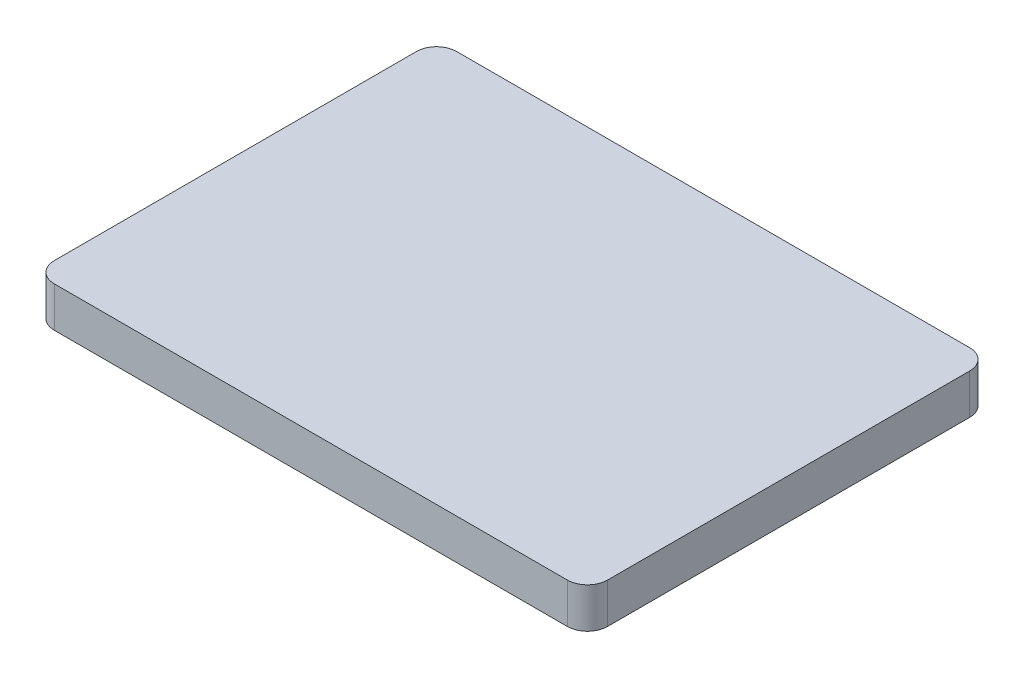
ISO-10303-21;
HEADER;
FILE_DESCRIPTION(('STEP AP214'),'2;1');
FILE_NAME('part.step','',(''),(''),'','','');
FILE_SCHEMA(('AUTOMOTIVE_DESIGN { 1 0 10303 214 1 1 1 1 }'));
ENDSEC;
DATA;
#1=APPLICATION_CONTEXT('core data for automotive mechanical design processes');
#2=APPLICATION_PROTOCOL_DEFINITION('international standard','automotive_design',2000,#1);
#3=PRODUCT_CONTEXT('',#1,'mechanical');
#4=PRODUCT('Part','Part','',(#3));
#5=PRODUCT_RELATED_PRODUCT_CATEGORY('part','',(#4));
#6=PRODUCT_DEFINITION_FORMATION('','',#4);
#7=PRODUCT_DEFINITION_CONTEXT('part definition',#1,'design');
#8=PRODUCT_DEFINITION('design','',#6,#7);
#9=PRODUCT_DEFINITION_SHAPE('','',#8);
#10=(LENGTH_UNIT() NAMED_UNIT(*) SI_UNIT(.MILLI.,.METRE.));
#11=(NAMED_UNIT(*) PLANE_ANGLE_UNIT() SI_UNIT($,.RADIAN.));
#12=(NAMED_UNIT(*) SI_UNIT($,.STERADIAN.) SOLID_ANGLE_UNIT());
#13=UNCERTAINTY_MEASURE_WITH_UNIT(LENGTH_MEASURE(1.E-05),#10,'distance_accuracy_value','');
#14=(GEOMETRIC_REPRESENTATION_CONTEXT(3) GLOBAL_UNCERTAINTY_ASSIGNED_CONTEXT((#13)) GLOBAL_UNIT_ASSIGNED_CONTEXT((#10,
#11,#12)) REPRESENTATION_CONTEXT('',''));
#15=CARTESIAN_POINT('',(0.,0.,0.));
#16=DIRECTION('',(0.,0.,1.));
#17=DIRECTION('',(1.,0.,0.));
#18=AXIS2_PLACEMENT_3D('',#15,#16,#17);
#19=CARTESIAN_POINT('',(2.75,0.4,2.));
#20=DIRECTION('',(-1.,0.,0.));
#21=DIRECTION('',(0.,0.,1.));
#22=AXIS2_PLACEMENT_3D('',#19,#20,#21);
#23=PLANE('',#22);
#24=DIRECTION('',(0.,0.,-1.));
#25=VECTOR('',#24,1.);
#26=CARTESIAN_POINT('',(2.75,0.,2.));
#27=LINE('',#26,#25);
#28=CARTESIAN_POINT('',(2.75,0.,1.8));
#29=VERTEX_POINT('',#28);
#30=CARTESIAN_POINT('',(2.75,0.,-1.8));
#31=VERTEX_POINT('',#30);
#32=EDGE_CURVE('E136',#29,#31,#27,.T.);
#33=ORIENTED_EDGE('',*,*,#32,.T.);
#34=DIRECTION('',(0.,-1.,0.));
#35=VECTOR('',#34,1.);
#36=CARTESIAN_POINT('',(2.75,0.4,-1.8));
#37=LINE('',#36,#35);
#38=CARTESIAN_POINT('',(2.75,0.4,-1.8));
#39=VERTEX_POINT('',#38);
#40=EDGE_CURVE('E111',#31,#39,#37,.F.);
#41=ORIENTED_EDGE('',*,*,#40,.T.);
#42=DIRECTION('',(0.,0.,-1.));
#43=VECTOR('',#42,1.);
#44=CARTESIAN_POINT('',(2.75,0.4,2.));
#45=LINE('',#44,#43);
#46=CARTESIAN_POINT('',(2.75,0.4,1.8));
#47=VERTEX_POINT('',#46);
#48=EDGE_CURVE('E148',#47,#39,#45,.T.);
#49=ORIENTED_EDGE('',*,*,#48,.F.);
#50=DIRECTION('',(0.,-1.,0.));
#51=VECTOR('',#50,1.);
#52=CARTESIAN_POINT('',(2.75,0.4,1.8));
#53=LINE('',#52,#51);
#54=EDGE_CURVE('E117',#47,#29,#53,.T.);
#55=ORIENTED_EDGE('',*,*,#54,.T.);
#56=EDGE_LOOP('',(#33,#41,#49,#55));
#57=FACE_BOUND('',#56,.T.);
#58=ADVANCED_FACE('F39',(#57),#23,.F.);
#59=CARTESIAN_POINT('',(-2.75,0.4,-2.));
#60=DIRECTION('',(0.,0.,1.));
#61=DIRECTION('',(1.,0.,0.));
#62=AXIS2_PLACEMENT_3D('',#59,#60,#61);
#63=PLANE('',#62);
#64=DIRECTION('',(-1.,0.,0.));
#65=VECTOR('',#64,1.);
#66=CARTESIAN_POINT('',(-2.75,0.4,-2.));
#67=LINE('',#66,#65);
#68=CARTESIAN_POINT('',(2.55,0.4,-2.));
#69=VERTEX_POINT('',#68);
#70=CARTESIAN_POINT('',(-2.55,0.4,-2.));
#71=VERTEX_POINT('',#70);
#72=EDGE_CURVE('E127',#69,#71,#67,.T.);
#73=ORIENTED_EDGE('',*,*,#72,.F.);
#74=DIRECTION('',(0.,-1.,0.));
#75=VECTOR('',#74,1.);
#76=CARTESIAN_POINT('',(2.55,0.4,-2.));
#77=LINE('',#76,#75);
#78=CARTESIAN_POINT('',(2.55,0.,-2.));
#79=VERTEX_POINT('',#78);
#80=EDGE_CURVE('E110',#69,#79,#77,.T.);
#81=ORIENTED_EDGE('',*,*,#80,.T.);
#82=DIRECTION('',(-1.,0.,0.));
#83=VECTOR('',#82,1.);
#84=CARTESIAN_POINT('',(-2.75,0.,-2.));
#85=LINE('',#84,#83);
#86=CARTESIAN_POINT('',(-2.55,0.,-2.));
#87=VERTEX_POINT('',#86);
#88=EDGE_CURVE('E124',#79,#87,#85,.T.);
#89=ORIENTED_EDGE('',*,*,#88,.T.);
#90=DIRECTION('',(0.,-1.,0.));
#91=VECTOR('',#90,1.);
#92=CARTESIAN_POINT('',(-2.55,0.4,-2.));
#93=LINE('',#92,#91);
#94=EDGE_CURVE('E130',#87,#71,#93,.F.);
#95=ORIENTED_EDGE('',*,*,#94,.T.);
#96=EDGE_LOOP('',(#73,#81,#89,#95));
#97=FACE_BOUND('',#96,.T.);
#98=ADVANCED_FACE('F123',(#97),#63,.F.);
#99=CARTESIAN_POINT('',(-2.75,0.4,2.));
#100=DIRECTION('',(1.,0.,0.));
#101=DIRECTION('',(0.,0.,-1.));
#102=AXIS2_PLACEMENT_3D('',#99,#100,#101);
#103=PLANE('',#102);
#104=DIRECTION('',(0.,0.,1.));
#105=VECTOR('',#104,1.);
#106=CARTESIAN_POINT('',(-2.75,0.,2.));
#107=LINE('',#106,#105);
#108=CARTESIAN_POINT('',(-2.75,0.,-1.8));
#109=VERTEX_POINT('',#108);
#110=CARTESIAN_POINT('',(-2.75,0.,1.8));
#111=VERTEX_POINT('',#110);
#112=EDGE_CURVE('E135',#109,#111,#107,.T.);
#113=ORIENTED_EDGE('',*,*,#112,.T.);
#114=DIRECTION('',(0.,-1.,0.));
#115=VECTOR('',#114,1.);
#116=CARTESIAN_POINT('',(-2.75,0.4,1.8));
#117=LINE('',#116,#115);
#118=CARTESIAN_POINT('',(-2.75,0.4,1.8));
#119=VERTEX_POINT('',#118);
#120=EDGE_CURVE('E11',#111,#119,#117,.F.);
#121=ORIENTED_EDGE('',*,*,#120,.T.);
#122=DIRECTION('',(0.,0.,1.));
#123=VECTOR('',#122,1.);
#124=CARTESIAN_POINT('',(-2.75,0.4,2.));
#125=LINE('',#124,#123);
#126=CARTESIAN_POINT('',(-2.75,0.4,-1.8));
#127=VERTEX_POINT('',#126);
#128=EDGE_CURVE('E187',#127,#119,#125,.T.);
#129=ORIENTED_EDGE('',*,*,#128,.F.);
#130=DIRECTION('',(0.,-1.,0.));
#131=VECTOR('',#130,1.);
#132=CARTESIAN_POINT('',(-2.75,0.4,-1.8));
#133=LINE('',#132,#131);
#134=EDGE_CURVE('E48',#127,#109,#133,.T.);
#135=ORIENTED_EDGE('',*,*,#134,.T.);
#136=EDGE_LOOP('',(#113,#121,#129,#135));
#137=FACE_BOUND('',#136,.T.);
#138=ADVANCED_FACE('F185',(#137),#103,.F.);
#139=CARTESIAN_POINT('',(-2.75,0.4,2.));
#140=DIRECTION('',(0.,0.,-1.));
#141=DIRECTION('',(-1.,0.,0.));
#142=AXIS2_PLACEMENT_3D('',#139,#140,#141);
#143=PLANE('',#142);
#144=DIRECTION('',(1.,0.,0.));
#145=VECTOR('',#144,1.);
#146=CARTESIAN_POINT('',(-2.75,0.,2.));
#147=LINE('',#146,#145);
#148=CARTESIAN_POINT('',(-2.55,0.,2.));
#149=VERTEX_POINT('',#148);
#150=CARTESIAN_POINT('',(2.55,0.,2.));
#151=VERTEX_POINT('',#150);
#152=EDGE_CURVE('E141',#149,#151,#147,.T.);
#153=ORIENTED_EDGE('',*,*,#152,.T.);
#154=DIRECTION('',(0.,-1.,0.));
#155=VECTOR('',#154,1.);
#156=CARTESIAN_POINT('',(2.55,0.4,2.));
#157=LINE('',#156,#155);
#158=CARTESIAN_POINT('',(2.55,0.4,2.));
#159=VERTEX_POINT('',#158);
#160=EDGE_CURVE('E55',#151,#159,#157,.F.);
#161=ORIENTED_EDGE('',*,*,#160,.T.);
#162=DIRECTION('',(1.,0.,0.));
#163=VECTOR('',#162,1.);
#164=CARTESIAN_POINT('',(-2.75,0.4,2.));
#165=LINE('',#164,#163);
#166=CARTESIAN_POINT('',(-2.55,0.4,2.));
#167=VERTEX_POINT('',#166);
#168=EDGE_CURVE('E150',#167,#159,#165,.T.);
#169=ORIENTED_EDGE('',*,*,#168,.F.);
#170=DIRECTION('',(0.,-1.,0.));
#171=VECTOR('',#170,1.);
#172=CARTESIAN_POINT('',(-2.55,0.4,2.));
#173=LINE('',#172,#171);
#174=EDGE_CURVE('E175',#167,#149,#173,.T.);
#175=ORIENTED_EDGE('',*,*,#174,.T.);
#176=EDGE_LOOP('',(#153,#161,#169,#175));
#177=FACE_BOUND('',#176,.T.);
#178=ADVANCED_FACE('F194',(#177),#143,.F.);
#179=CARTESIAN_POINT('',(0.,0.4,0.));
#180=DIRECTION('',(0.,-1.,0.));
#181=DIRECTION('',(0.,0.,-1.));
#182=AXIS2_PLACEMENT_3D('',#179,#180,#181);
#183=PLANE('',#182);
#184=ORIENTED_EDGE('',*,*,#48,.T.);
#185=CARTESIAN_POINT('',(2.55,0.4,-1.8));
#186=DIRECTION('',(0.,-1.,0.));
#187=DIRECTION('',(0.,0.,-1.));
#188=AXIS2_PLACEMENT_3D('',#185,#186,#187);
#189=CIRCLE('',#188,0.2);
#190=EDGE_CURVE('E172',#39,#69,#189,.F.);
#191=ORIENTED_EDGE('',*,*,#190,.T.);
#192=ORIENTED_EDGE('',*,*,#72,.T.);
#193=CARTESIAN_POINT('',(-2.55,0.4,-1.8));
#194=DIRECTION('',(0.,-1.,0.));
#195=DIRECTION('',(0.,0.,-1.));
#196=AXIS2_PLACEMENT_3D('',#193,#194,#195);
#197=CIRCLE('',#196,0.2);
#198=EDGE_CURVE('E164',#71,#127,#197,.F.);
#199=ORIENTED_EDGE('',*,*,#198,.T.);
#200=ORIENTED_EDGE('',*,*,#128,.T.);
#201=CARTESIAN_POINT('',(-2.55,0.4,1.8));
#202=DIRECTION('',(0.,-1.,0.));
#203=DIRECTION('',(0.,0.,-1.));
#204=AXIS2_PLACEMENT_3D('',#201,#202,#203);
#205=CIRCLE('',#204,0.2);
#206=EDGE_CURVE('E62',#119,#167,#205,.F.);
#207=ORIENTED_EDGE('',*,*,#206,.T.);
#208=ORIENTED_EDGE('',*,*,#168,.T.);
#209=CARTESIAN_POINT('',(2.55,0.4,1.8));
#210=DIRECTION('',(0.,-1.,0.));
#211=DIRECTION('',(0.,0.,-1.));
#212=AXIS2_PLACEMENT_3D('',#209,#210,#211);
#213=CIRCLE('',#212,0.2);
#214=EDGE_CURVE('E169',#159,#47,#213,.F.);
#215=ORIENTED_EDGE('',*,*,#214,.T.);
#216=EDGE_LOOP('',(#184,#191,#192,#199,#200,#207,#208,#215));
#217=FACE_BOUND('',#216,.T.);
#218=ADVANCED_FACE('F205',(#217),#183,.F.);
#219=CARTESIAN_POINT('',(0.,0.,0.));
#220=DIRECTION('',(0.,-1.,0.));
#221=DIRECTION('',(0.,0.,-1.));
#222=AXIS2_PLACEMENT_3D('',#219,#220,#221);
#223=PLANE('',#222);
#224=ORIENTED_EDGE('',*,*,#88,.F.);
#225=CARTESIAN_POINT('',(2.55,0.,-1.8));
#226=DIRECTION('',(0.,-1.,0.));
#227=DIRECTION('',(0.,0.,-1.));
#228=AXIS2_PLACEMENT_3D('',#225,#226,#227);
#229=CIRCLE('',#228,0.2);
#230=EDGE_CURVE('E106',#79,#31,#229,.T.);
#231=ORIENTED_EDGE('',*,*,#230,.T.);
#232=ORIENTED_EDGE('',*,*,#32,.F.);
#233=CARTESIAN_POINT('',(2.55,0.,1.8));
#234=DIRECTION('',(0.,-1.,0.));
#235=DIRECTION('',(0.,0.,-1.));
#236=AXIS2_PLACEMENT_3D('',#233,#234,#235);
#237=CIRCLE('',#236,0.2);
#238=EDGE_CURVE('E118',#29,#151,#237,.T.);
#239=ORIENTED_EDGE('',*,*,#238,.T.);
#240=ORIENTED_EDGE('',*,*,#152,.F.);
#241=CARTESIAN_POINT('',(-2.55,0.,1.8));
#242=DIRECTION('',(0.,-1.,0.));
#243=DIRECTION('',(0.,0.,-1.));
#244=AXIS2_PLACEMENT_3D('',#241,#242,#243);
#245=CIRCLE('',#244,0.2);
#246=EDGE_CURVE('E154',#149,#111,#245,.T.);
#247=ORIENTED_EDGE('',*,*,#246,.T.);
#248=ORIENTED_EDGE('',*,*,#112,.F.);
#249=CARTESIAN_POINT('',(-2.55,0.,-1.8));
#250=DIRECTION('',(0.,-1.,0.));
#251=DIRECTION('',(0.,0.,-1.));
#252=AXIS2_PLACEMENT_3D('',#249,#250,#251);
#253=CIRCLE('',#252,0.2);
#254=EDGE_CURVE('E129',#109,#87,#253,.T.);
#255=ORIENTED_EDGE('',*,*,#254,.T.);
#256=EDGE_LOOP('',(#224,#231,#232,#239,#240,#247,#248,#255));
#257=FACE_BOUND('',#256,.T.);
#258=ADVANCED_FACE('F132',(#257),#223,.T.);
#259=CARTESIAN_POINT('',(2.55,0.4,-1.8));
#260=DIRECTION('',(0.,-1.,0.));
#261=DIRECTION('',(0.,0.,-1.));
#262=AXIS2_PLACEMENT_3D('',#259,#260,#261);
#263=CYLINDRICAL_SURFACE('',#262,0.2);
#264=ORIENTED_EDGE('',*,*,#190,.F.);
#265=ORIENTED_EDGE('',*,*,#40,.F.);
#266=ORIENTED_EDGE('',*,*,#230,.F.);
#267=ORIENTED_EDGE('',*,*,#80,.F.);
#268=EDGE_LOOP('',(#264,#265,#266,#267));
#269=FACE_BOUND('',#268,.T.);
#270=ADVANCED_FACE('F109',(#269),#263,.T.);
#271=CARTESIAN_POINT('',(2.55,0.4,1.8));
#272=DIRECTION('',(0.,-1.,0.));
#273=DIRECTION('',(0.,0.,-1.));
#274=AXIS2_PLACEMENT_3D('',#271,#272,#273);
#275=CYLINDRICAL_SURFACE('',#274,0.2);
#276=ORIENTED_EDGE('',*,*,#214,.F.);
#277=ORIENTED_EDGE('',*,*,#160,.F.);
#278=ORIENTED_EDGE('',*,*,#238,.F.);
#279=ORIENTED_EDGE('',*,*,#54,.F.);
#280=EDGE_LOOP('',(#276,#277,#278,#279));
#281=FACE_BOUND('',#280,.T.);
#282=ADVANCED_FACE('F209',(#281),#275,.T.);
#283=CARTESIAN_POINT('',(-2.55,0.4,1.8));
#284=DIRECTION('',(0.,-1.,0.));
#285=DIRECTION('',(0.,0.,-1.));
#286=AXIS2_PLACEMENT_3D('',#283,#284,#285);
#287=CYLINDRICAL_SURFACE('',#286,0.2);
#288=ORIENTED_EDGE('',*,*,#206,.F.);
#289=ORIENTED_EDGE('',*,*,#120,.F.);
#290=ORIENTED_EDGE('',*,*,#246,.F.);
#291=ORIENTED_EDGE('',*,*,#174,.F.);
#292=EDGE_LOOP('',(#288,#289,#290,#291));
#293=FACE_BOUND('',#292,.T.);
#294=ADVANCED_FACE('F193',(#293),#287,.T.);
#295=CARTESIAN_POINT('',(-2.55,0.4,-1.8));
#296=DIRECTION('',(0.,-1.,0.));
#297=DIRECTION('',(0.,0.,-1.));
#298=AXIS2_PLACEMENT_3D('',#295,#296,#297);
#299=CYLINDRICAL_SURFACE('',#298,0.2);
#300=ORIENTED_EDGE('',*,*,#198,.F.);
#301=ORIENTED_EDGE('',*,*,#94,.F.);
#302=ORIENTED_EDGE('',*,*,#254,.F.);
#303=ORIENTED_EDGE('',*,*,#134,.F.);
#304=EDGE_LOOP('',(#300,#301,#302,#303));
#305=FACE_BOUND('',#304,.T.);
#306=ADVANCED_FACE('F41',(#305),#299,.T.);
#307=CLOSED_SHELL('',(#58,#98,#138,#178,#218,#258,#270,#282,#294,#306));
#308=MANIFOLD_SOLID_BREP('B2',#307);
#309=ADVANCED_BREP_SHAPE_REPRESENTATION('',(#18,#308),#14);
#310=SHAPE_DEFINITION_REPRESENTATION(#9,#309);
ENDSEC;
END-ISO-10303-21;
